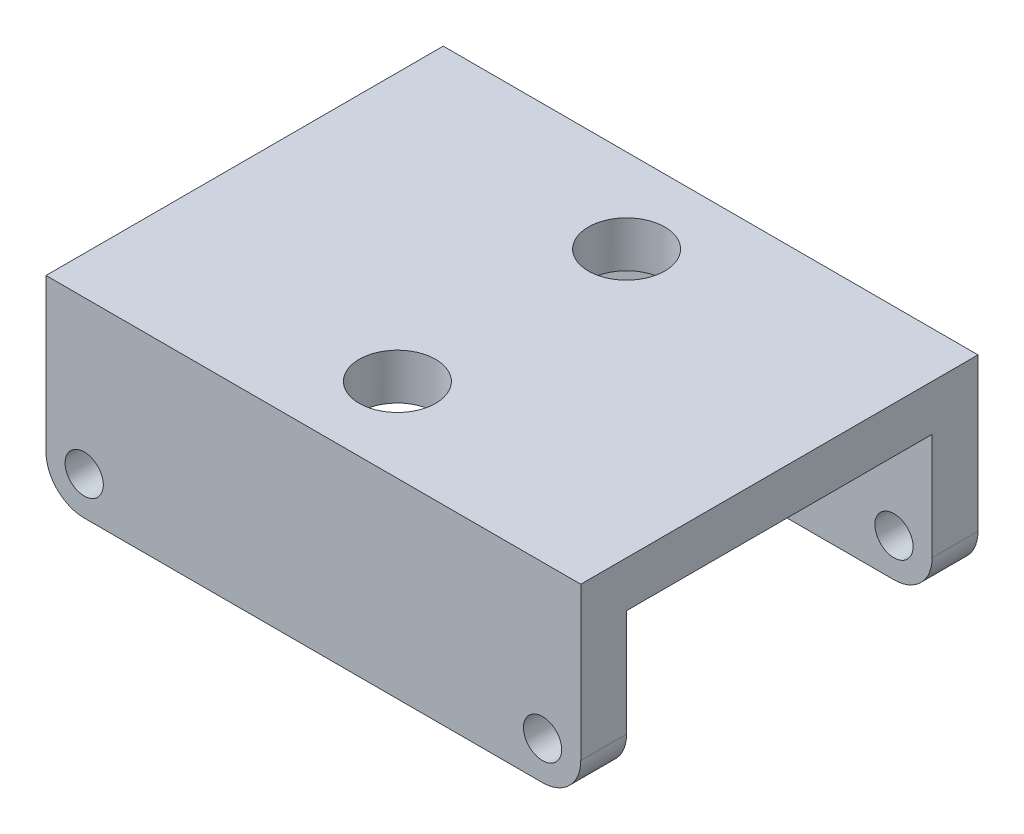
ISO-10303-21;
HEADER;
FILE_DESCRIPTION(('STEP AP214'),'2;1');
FILE_NAME('part.step','',(''),(''),'','','');
FILE_SCHEMA(('AUTOMOTIVE_DESIGN { 1 0 10303 214 1 1 1 1 }'));
ENDSEC;
DATA;
#1=APPLICATION_CONTEXT('core data for automotive mechanical design processes');
#2=APPLICATION_PROTOCOL_DEFINITION('international standard','automotive_design',2000,#1);
#3=PRODUCT_CONTEXT('',#1,'mechanical');
#4=PRODUCT('Part','Part','',(#3));
#5=PRODUCT_RELATED_PRODUCT_CATEGORY('part','',(#4));
#6=PRODUCT_DEFINITION_FORMATION('','',#4);
#7=PRODUCT_DEFINITION_CONTEXT('part definition',#1,'design');
#8=PRODUCT_DEFINITION('design','',#6,#7);
#9=PRODUCT_DEFINITION_SHAPE('','',#8);
#10=(LENGTH_UNIT() NAMED_UNIT(*) SI_UNIT(.MILLI.,.METRE.));
#11=(NAMED_UNIT(*) PLANE_ANGLE_UNIT() SI_UNIT($,.RADIAN.));
#12=(NAMED_UNIT(*) SI_UNIT($,.STERADIAN.) SOLID_ANGLE_UNIT());
#13=UNCERTAINTY_MEASURE_WITH_UNIT(LENGTH_MEASURE(1.E-05),#10,'distance_accuracy_value','');
#14=(GEOMETRIC_REPRESENTATION_CONTEXT(3) GLOBAL_UNCERTAINTY_ASSIGNED_CONTEXT((#13)) GLOBAL_UNIT_ASSIGNED_CONTEXT((#10,
#11,#12)) REPRESENTATION_CONTEXT('',''));
#15=CARTESIAN_POINT('',(0.,0.,0.));
#16=DIRECTION('',(0.,0.,1.));
#17=DIRECTION('',(1.,0.,0.));
#18=AXIS2_PLACEMENT_3D('',#15,#16,#17);
#19=CARTESIAN_POINT('',(22.2297705016347,10.4554465319777,52.));
#20=DIRECTION('',(0.,-1.,0.));
#21=DIRECTION('',(1.,0.,0.));
#22=AXIS2_PLACEMENT_3D('',#19,#20,#21);
#23=PLANE('',#22);
#24=DIRECTION('',(-1.,0.,0.));
#25=VECTOR('',#24,1.);
#26=CARTESIAN_POINT('',(22.2297705016347,10.4554465319777,0.));
#27=LINE('',#26,#25);
#28=CARTESIAN_POINT('',(22.2297705016347,10.4554465319777,0.));
#29=VERTEX_POINT('',#28);
#30=CARTESIAN_POINT('',(-47.7702294983653,10.4554465319777,0.));
#31=VERTEX_POINT('',#30);
#32=EDGE_CURVE('E197',#29,#31,#27,.T.);
#33=ORIENTED_EDGE('',*,*,#32,.T.);
#34=DIRECTION('',(0.,0.,-1.));
#35=VECTOR('',#34,1.);
#36=CARTESIAN_POINT('',(-47.7702294983653,10.4554465319777,52.));
#37=LINE('',#36,#35);
#38=CARTESIAN_POINT('',(-47.7702294983653,10.4554465319777,52.));
#39=VERTEX_POINT('',#38);
#40=EDGE_CURVE('E224',#39,#31,#37,.T.);
#41=ORIENTED_EDGE('',*,*,#40,.F.);
#42=DIRECTION('',(-1.,0.,0.));
#43=VECTOR('',#42,1.);
#44=CARTESIAN_POINT('',(22.2297705016347,10.4554465319777,52.));
#45=LINE('',#44,#43);
#46=CARTESIAN_POINT('',(22.2297705016347,10.4554465319777,52.));
#47=VERTEX_POINT('',#46);
#48=EDGE_CURVE('E200',#47,#39,#45,.T.);
#49=ORIENTED_EDGE('',*,*,#48,.F.);
#50=DIRECTION('',(0.,0.,-1.));
#51=VECTOR('',#50,1.);
#52=CARTESIAN_POINT('',(22.2297705016347,10.4554465319777,52.));
#53=LINE('',#52,#51);
#54=EDGE_CURVE('E212',#47,#29,#53,.T.);
#55=ORIENTED_EDGE('',*,*,#54,.T.);
#56=EDGE_LOOP('',(#33,#41,#49,#55));
#57=FACE_BOUND('',#56,.T.);
#58=CARTESIAN_POINT('',(-12.7702294983653,10.4554465319777,41.));
#59=DIRECTION('',(0.,-1.,0.));
#60=DIRECTION('',(1.,0.,0.));
#61=AXIS2_PLACEMENT_3D('',#58,#59,#60);
#62=CIRCLE('',#61,5.);
#63=CARTESIAN_POINT('',(-7.77022949836533,10.4554465319777,41.));
#64=VERTEX_POINT('',#63);
#65=EDGE_CURVE('E327',#64,#64,#62,.T.);
#66=ORIENTED_EDGE('',*,*,#65,.T.);
#67=EDGE_LOOP('',(#66));
#68=FACE_BOUND('',#67,.T.);
#69=CARTESIAN_POINT('',(-12.7702294983653,10.4554465319777,11.));
#70=DIRECTION('',(0.,1.,0.));
#71=DIRECTION('',(-1.,0.,0.));
#72=AXIS2_PLACEMENT_3D('',#69,#70,#71);
#73=CIRCLE('',#72,5.);
#74=CARTESIAN_POINT('',(-17.7702294983653,10.4554465319777,11.));
#75=VERTEX_POINT('',#74);
#76=EDGE_CURVE('E325',#75,#75,#73,.T.);
#77=ORIENTED_EDGE('',*,*,#76,.F.);
#78=EDGE_LOOP('',(#77));
#79=FACE_BOUND('',#78,.T.);
#80=ADVANCED_FACE('F35',(#57,#68,#79),#23,.F.);
#81=CARTESIAN_POINT('',(22.2297705016347,4.45544653197772,46.));
#82=DIRECTION('',(0.,1.,0.));
#83=DIRECTION('',(-1.,0.,0.));
#84=AXIS2_PLACEMENT_3D('',#81,#82,#83);
#85=PLANE('',#84);
#86=DIRECTION('',(-1.,0.,0.));
#87=VECTOR('',#86,1.);
#88=CARTESIAN_POINT('',(22.2297705016347,4.45544653197772,6.));
#89=LINE('',#88,#87);
#90=CARTESIAN_POINT('',(-12.7702294983653,4.4554465319777,6.));
#91=VERTEX_POINT('',#90);
#92=CARTESIAN_POINT('',(-47.7702294983653,4.45544653197769,6.));
#93=VERTEX_POINT('',#92);
#94=EDGE_CURVE('E139',#91,#93,#89,.T.);
#95=ORIENTED_EDGE('',*,*,#94,.F.);
#96=CARTESIAN_POINT('',(-12.7702294983653,4.45544653197771,11.));
#97=DIRECTION('',(0.,1.,0.));
#98=DIRECTION('',(-1.,0.,0.));
#99=AXIS2_PLACEMENT_3D('',#96,#97,#98);
#100=CIRCLE('',#99,5.);
#101=EDGE_CURVE('E55',#91,#91,#100,.T.);
#102=ORIENTED_EDGE('',*,*,#101,.T.);
#103=CARTESIAN_POINT('',(22.2297705016347,4.45544653197772,6.));
#104=VERTEX_POINT('',#103);
#105=EDGE_CURVE('E129',#104,#91,#89,.T.);
#106=ORIENTED_EDGE('',*,*,#105,.F.);
#107=DIRECTION('',(0.,0.,-1.));
#108=VECTOR('',#107,1.);
#109=CARTESIAN_POINT('',(22.2297705016347,4.45544653197772,46.));
#110=LINE('',#109,#108);
#111=CARTESIAN_POINT('',(22.2297705016347,4.45544653197772,46.));
#112=VERTEX_POINT('',#111);
#113=EDGE_CURVE('E135',#112,#104,#110,.T.);
#114=ORIENTED_EDGE('',*,*,#113,.F.);
#115=DIRECTION('',(-1.,0.,0.));
#116=VECTOR('',#115,1.);
#117=CARTESIAN_POINT('',(22.2297705016347,4.45544653197772,46.));
#118=LINE('',#117,#116);
#119=CARTESIAN_POINT('',(-12.7702294983653,4.45544653197771,46.));
#120=VERTEX_POINT('',#119);
#121=EDGE_CURVE('E167',#112,#120,#118,.T.);
#122=ORIENTED_EDGE('',*,*,#121,.T.);
#123=CARTESIAN_POINT('',(-12.7702294983653,4.45544653197771,41.));
#124=DIRECTION('',(0.,1.,0.));
#125=DIRECTION('',(-1.,0.,0.));
#126=AXIS2_PLACEMENT_3D('',#123,#124,#125);
#127=CIRCLE('',#126,5.);
#128=EDGE_CURVE('E50',#120,#120,#127,.F.);
#129=ORIENTED_EDGE('',*,*,#128,.F.);
#130=CARTESIAN_POINT('',(-47.7702294983653,4.4554465319777,46.));
#131=VERTEX_POINT('',#130);
#132=EDGE_CURVE('E170',#120,#131,#118,.T.);
#133=ORIENTED_EDGE('',*,*,#132,.T.);
#134=DIRECTION('',(0.,0.,-1.));
#135=VECTOR('',#134,1.);
#136=CARTESIAN_POINT('',(-47.7702294983653,4.4554465319777,46.));
#137=LINE('',#136,#135);
#138=EDGE_CURVE('E163',#131,#93,#137,.T.);
#139=ORIENTED_EDGE('',*,*,#138,.T.);
#140=EDGE_LOOP('',(#95,#102,#106,#114,#122,#129,#133,#139));
#141=FACE_BOUND('',#140,.T.);
#142=ADVANCED_FACE('F132',(#141),#85,.F.);
#143=CARTESIAN_POINT('',(17.2297705016347,-9.5445534680223,52.));
#144=DIRECTION('',(0.,0.,-1.));
#145=DIRECTION('',(-1.,0.,0.));
#146=AXIS2_PLACEMENT_3D('',#143,#144,#145);
#147=CYLINDRICAL_SURFACE('',#146,5.);
#148=CARTESIAN_POINT('',(17.2297705016347,-9.5445534680223,46.));
#149=DIRECTION('',(0.,0.,1.));
#150=DIRECTION('',(1.,0.,0.));
#151=AXIS2_PLACEMENT_3D('',#148,#149,#150);
#152=CIRCLE('',#151,5.);
#153=CARTESIAN_POINT('',(22.2297705016347,-9.5445534680223,46.));
#154=VERTEX_POINT('',#153);
#155=CARTESIAN_POINT('',(17.2297705016347,-14.5445534680223,46.));
#156=VERTEX_POINT('',#155);
#157=EDGE_CURVE('E185',#154,#156,#152,.F.);
#158=ORIENTED_EDGE('',*,*,#157,.F.);
#159=DIRECTION('',(0.,0.,-1.));
#160=VECTOR('',#159,1.);
#161=CARTESIAN_POINT('',(22.2297705016347,-9.5445534680223,52.));
#162=LINE('',#161,#160);
#163=CARTESIAN_POINT('',(22.2297705016347,-9.5445534680223,52.));
#164=VERTEX_POINT('',#163);
#165=EDGE_CURVE('E240',#164,#154,#162,.T.);
#166=ORIENTED_EDGE('',*,*,#165,.F.);
#167=CARTESIAN_POINT('',(17.2297705016347,-9.5445534680223,52.));
#168=DIRECTION('',(0.,0.,1.));
#169=DIRECTION('',(1.,0.,0.));
#170=AXIS2_PLACEMENT_3D('',#167,#168,#169);
#171=CIRCLE('',#170,5.);
#172=CARTESIAN_POINT('',(17.2297705016347,-14.5445534680223,52.));
#173=VERTEX_POINT('',#172);
#174=EDGE_CURVE('E44',#173,#164,#171,.T.);
#175=ORIENTED_EDGE('',*,*,#174,.F.);
#176=DIRECTION('',(0.,0.,-1.));
#177=VECTOR('',#176,1.);
#178=CARTESIAN_POINT('',(17.2297705016347,-14.5445534680223,52.));
#179=LINE('',#178,#177);
#180=EDGE_CURVE('E242',#156,#173,#179,.F.);
#181=ORIENTED_EDGE('',*,*,#180,.F.);
#182=EDGE_LOOP('',(#158,#166,#175,#181));
#183=FACE_BOUND('',#182,.T.);
#184=ADVANCED_FACE('F284',(#183),#147,.T.);
#185=CARTESIAN_POINT('',(-42.7702294983653,-9.54455346802231,52.));
#186=DIRECTION('',(0.,0.,-1.));
#187=DIRECTION('',(-1.,0.,0.));
#188=AXIS2_PLACEMENT_3D('',#185,#186,#187);
#189=CYLINDRICAL_SURFACE('',#188,5.);
#190=CARTESIAN_POINT('',(-42.7702294983653,-9.54455346802231,46.));
#191=DIRECTION('',(0.,0.,1.));
#192=DIRECTION('',(1.,0.,0.));
#193=AXIS2_PLACEMENT_3D('',#190,#191,#192);
#194=CIRCLE('',#193,5.);
#195=CARTESIAN_POINT('',(-42.7702294983653,-14.5445534680223,46.));
#196=VERTEX_POINT('',#195);
#197=CARTESIAN_POINT('',(-47.7702294983653,-9.5445534680223,46.));
#198=VERTEX_POINT('',#197);
#199=EDGE_CURVE('E183',#196,#198,#194,.F.);
#200=ORIENTED_EDGE('',*,*,#199,.F.);
#201=DIRECTION('',(0.,0.,-1.));
#202=VECTOR('',#201,1.);
#203=CARTESIAN_POINT('',(-42.7702294983653,-14.5445534680223,52.));
#204=LINE('',#203,#202);
#205=CARTESIAN_POINT('',(-42.7702294983653,-14.5445534680223,52.));
#206=VERTEX_POINT('',#205);
#207=EDGE_CURVE('E228',#206,#196,#204,.T.);
#208=ORIENTED_EDGE('',*,*,#207,.F.);
#209=CARTESIAN_POINT('',(-42.7702294983653,-9.54455346802231,52.));
#210=DIRECTION('',(0.,0.,1.));
#211=DIRECTION('',(1.,0.,0.));
#212=AXIS2_PLACEMENT_3D('',#209,#210,#211);
#213=CIRCLE('',#212,5.);
#214=CARTESIAN_POINT('',(-47.7702294983653,-9.5445534680223,52.));
#215=VERTEX_POINT('',#214);
#216=EDGE_CURVE('E235',#215,#206,#213,.T.);
#217=ORIENTED_EDGE('',*,*,#216,.F.);
#218=DIRECTION('',(0.,0.,-1.));
#219=VECTOR('',#218,1.);
#220=CARTESIAN_POINT('',(-47.7702294983653,-9.54455346802231,52.));
#221=LINE('',#220,#219);
#222=EDGE_CURVE('E231',#198,#215,#221,.F.);
#223=ORIENTED_EDGE('',*,*,#222,.F.);
#224=EDGE_LOOP('',(#200,#208,#217,#223));
#225=FACE_BOUND('',#224,.T.);
#226=ADVANCED_FACE('F290',(#225),#189,.T.);
#227=CARTESIAN_POINT('',(-47.7702294983653,-14.5445534680223,52.));
#228=DIRECTION('',(0.,1.,0.));
#229=DIRECTION('',(-1.,0.,0.));
#230=AXIS2_PLACEMENT_3D('',#227,#228,#229);
#231=PLANE('',#230);
#232=ORIENTED_EDGE('',*,*,#207,.T.);
#233=DIRECTION('',(-1.,0.,0.));
#234=VECTOR('',#233,1.);
#235=CARTESIAN_POINT('',(22.2297705016347,-14.5445534680223,46.));
#236=LINE('',#235,#234);
#237=EDGE_CURVE('E171',#156,#196,#236,.T.);
#238=ORIENTED_EDGE('',*,*,#237,.F.);
#239=ORIENTED_EDGE('',*,*,#180,.T.);
#240=DIRECTION('',(1.,0.,0.));
#241=VECTOR('',#240,1.);
#242=CARTESIAN_POINT('',(-47.7702294983653,-14.5445534680223,52.));
#243=LINE('',#242,#241);
#244=EDGE_CURVE('E207',#206,#173,#243,.T.);
#245=ORIENTED_EDGE('',*,*,#244,.F.);
#246=EDGE_LOOP('',(#232,#238,#239,#245));
#247=FACE_BOUND('',#246,.T.);
#248=ADVANCED_FACE('F297',(#247),#231,.F.);
#249=CARTESIAN_POINT('',(-42.7702294983653,-9.54455346802231,52.));
#250=DIRECTION('',(0.,0.,-1.));
#251=DIRECTION('',(-1.,0.,0.));
#252=AXIS2_PLACEMENT_3D('',#249,#250,#251);
#253=CYLINDRICAL_SURFACE('',#252,2.5);
#254=CARTESIAN_POINT('',(-42.7702294983653,-9.54455346802231,46.));
#255=DIRECTION('',(0.,0.,1.));
#256=DIRECTION('',(1.,0.,0.));
#257=AXIS2_PLACEMENT_3D('',#254,#255,#256);
#258=CIRCLE('',#257,2.5);
#259=CARTESIAN_POINT('',(-45.2702294983653,-9.54455346802231,46.));
#260=VERTEX_POINT('',#259);
#261=EDGE_CURVE('E180',#260,#260,#258,.T.);
#262=CARTESIAN_POINT('',(-42.7702294983653,-9.54455346802231,52.));
#263=DIRECTION('',(0.,0.,1.));
#264=DIRECTION('',(1.,0.,0.));
#265=AXIS2_PLACEMENT_3D('',#262,#263,#264);
#266=CIRCLE('',#265,2.5);
#267=CARTESIAN_POINT('',(-45.2702294983653,-9.54455346802231,52.));
#268=VERTEX_POINT('',#267);
#269=EDGE_CURVE('E194',#268,#268,#266,.T.);
#270=CARTESIAN_POINT('',(-45.2702294983653,-9.54455346802231,46.));
#271=CARTESIAN_POINT('',(-45.2702294983653,-9.54455346802231,46.0625));
#272=CARTESIAN_POINT('',(-45.2702294983653,-9.54455346802231,46.125));
#273=CARTESIAN_POINT('',(-45.2702294983653,-9.54455346802231,46.25));
#274=CARTESIAN_POINT('',(-45.2702294983653,-9.54455346802231,46.3125));
#275=CARTESIAN_POINT('',(-45.2702294983653,-9.54455346802231,46.4375));
#276=CARTESIAN_POINT('',(-45.2702294983653,-9.54455346802231,46.5));
#277=CARTESIAN_POINT('',(-45.2702294983653,-9.54455346802231,46.625));
#278=CARTESIAN_POINT('',(-45.2702294983653,-9.54455346802231,46.6875));
#279=CARTESIAN_POINT('',(-45.2702294983653,-9.54455346802231,46.8125));
#280=CARTESIAN_POINT('',(-45.2702294983653,-9.54455346802231,46.875));
#281=CARTESIAN_POINT('',(-45.2702294983653,-9.54455346802231,47.));
#282=CARTESIAN_POINT('',(-45.2702294983653,-9.54455346802231,47.0625));
#283=CARTESIAN_POINT('',(-45.2702294983653,-9.54455346802231,47.1875));
#284=CARTESIAN_POINT('',(-45.2702294983653,-9.54455346802231,47.25));
#285=CARTESIAN_POINT('',(-45.2702294983653,-9.54455346802231,47.375));
#286=CARTESIAN_POINT('',(-45.2702294983653,-9.54455346802231,47.4375));
#287=CARTESIAN_POINT('',(-45.2702294983653,-9.54455346802231,47.5625));
#288=CARTESIAN_POINT('',(-45.2702294983653,-9.54455346802231,47.625));
#289=CARTESIAN_POINT('',(-45.2702294983653,-9.54455346802231,47.75));
#290=CARTESIAN_POINT('',(-45.2702294983653,-9.54455346802231,47.8125));
#291=CARTESIAN_POINT('',(-45.2702294983653,-9.54455346802231,47.9375));
#292=CARTESIAN_POINT('',(-45.2702294983653,-9.54455346802231,48.));
#293=CARTESIAN_POINT('',(-45.2702294983653,-9.54455346802231,48.125));
#294=CARTESIAN_POINT('',(-45.2702294983653,-9.54455346802231,48.1875));
#295=CARTESIAN_POINT('',(-45.2702294983653,-9.54455346802231,48.3125));
#296=CARTESIAN_POINT('',(-45.2702294983653,-9.54455346802231,48.375));
#297=CARTESIAN_POINT('',(-45.2702294983653,-9.54455346802231,48.5));
#298=CARTESIAN_POINT('',(-45.2702294983653,-9.54455346802231,48.5625));
#299=CARTESIAN_POINT('',(-45.2702294983653,-9.54455346802231,48.6875));
#300=CARTESIAN_POINT('',(-45.2702294983653,-9.54455346802231,48.75));
#301=CARTESIAN_POINT('',(-45.2702294983653,-9.54455346802231,48.875));
#302=CARTESIAN_POINT('',(-45.2702294983653,-9.54455346802231,48.9375));
#303=CARTESIAN_POINT('',(-45.2702294983653,-9.54455346802231,49.0625));
#304=CARTESIAN_POINT('',(-45.2702294983653,-9.54455346802231,49.125));
#305=CARTESIAN_POINT('',(-45.2702294983653,-9.54455346802231,49.25));
#306=CARTESIAN_POINT('',(-45.2702294983653,-9.54455346802231,49.3125));
#307=CARTESIAN_POINT('',(-45.2702294983653,-9.54455346802231,49.4375));
#308=CARTESIAN_POINT('',(-45.2702294983653,-9.54455346802231,49.5));
#309=CARTESIAN_POINT('',(-45.2702294983653,-9.54455346802231,49.625));
#310=CARTESIAN_POINT('',(-45.2702294983653,-9.54455346802231,49.6875));
#311=CARTESIAN_POINT('',(-45.2702294983653,-9.54455346802231,49.8125));
#312=CARTESIAN_POINT('',(-45.2702294983653,-9.54455346802231,49.875));
#313=CARTESIAN_POINT('',(-45.2702294983653,-9.54455346802231,50.));
#314=CARTESIAN_POINT('',(-45.2702294983653,-9.54455346802231,50.0625));
#315=CARTESIAN_POINT('',(-45.2702294983653,-9.54455346802231,50.1875));
#316=CARTESIAN_POINT('',(-45.2702294983653,-9.54455346802231,50.25));
#317=CARTESIAN_POINT('',(-45.2702294983653,-9.54455346802231,50.375));
#318=CARTESIAN_POINT('',(-45.2702294983653,-9.54455346802231,50.4375));
#319=CARTESIAN_POINT('',(-45.2702294983653,-9.54455346802231,50.5625));
#320=CARTESIAN_POINT('',(-45.2702294983653,-9.54455346802231,50.625));
#321=CARTESIAN_POINT('',(-45.2702294983653,-9.54455346802231,50.75));
#322=CARTESIAN_POINT('',(-45.2702294983653,-9.54455346802231,50.8125));
#323=CARTESIAN_POINT('',(-45.2702294983653,-9.54455346802231,50.9375));
#324=CARTESIAN_POINT('',(-45.2702294983653,-9.54455346802231,51.));
#325=CARTESIAN_POINT('',(-45.2702294983653,-9.54455346802231,51.125));
#326=CARTESIAN_POINT('',(-45.2702294983653,-9.54455346802231,51.1875));
#327=CARTESIAN_POINT('',(-45.2702294983653,-9.54455346802231,51.3125));
#328=CARTESIAN_POINT('',(-45.2702294983653,-9.54455346802231,51.375));
#329=CARTESIAN_POINT('',(-45.2702294983653,-9.54455346802231,51.5));
#330=CARTESIAN_POINT('',(-45.2702294983653,-9.54455346802231,51.5625));
#331=CARTESIAN_POINT('',(-45.2702294983653,-9.54455346802231,51.6875));
#332=CARTESIAN_POINT('',(-45.2702294983653,-9.54455346802231,51.75));
#333=CARTESIAN_POINT('',(-45.2702294983653,-9.54455346802231,51.875));
#334=CARTESIAN_POINT('',(-45.2702294983653,-9.54455346802231,51.9375));
#335=CARTESIAN_POINT('',(-45.2702294983653,-9.54455346802231,52.));
#336=B_SPLINE_CURVE_WITH_KNOTS('',3,(#270,#271,#272,#273,#274,#275,#276,#277,#278,#279,#280,
#281,#282,#283,#284,#285,#286,#287,#288,#289,#290,#291,#292,#293,#294,#295,#296,#297,#298,#299,
#300,#301,#302,#303,#304,#305,#306,#307,#308,#309,#310,#311,#312,#313,#314,#315,#316,#317,#318,
#319,#320,#321,#322,#323,#324,#325,#326,#327,#328,#329,#330,#331,#332,#333,#334,#335),
.UNSPECIFIED.,.F.,.F.,(4,2,2,2,2,2,2,2,2,2,2,2,2,2,2,2,2,2,2,2,2,2,2,2,2,2,2,2,2,2,2,2,4),(0.,
0.1875,0.375,0.5625,0.750000000000001,0.937500000000001,1.125,1.3125,1.5,1.6875,1.875,2.0625,
2.25,2.4375,2.625,2.8125,3.,3.1875,3.375,3.5625,3.75,3.9375,4.125,4.3125,4.5,4.6875,4.875,
5.0625,5.25,5.4375,5.62500000000001,5.81250000000001,6.00000000000001),.UNSPECIFIED.);
#337=EDGE_CURVE('BSEAM303',#260,#268,#336,.T.);
#338=ORIENTED_EDGE('',*,*,#261,.F.);
#339=ORIENTED_EDGE('',*,*,#269,.T.);
#340=ORIENTED_EDGE('',*,*,#337,.T.);
#341=ORIENTED_EDGE('',*,*,#337,.F.);
#342=EDGE_LOOP('',(#338,#340,#339,#341));
#343=FACE_BOUND('',#342,.T.);
#344=ADVANCED_FACE('F303',(#343),#253,.F.);
#345=CARTESIAN_POINT('',(17.2297705016347,-9.5445534680223,52.));
#346=DIRECTION('',(0.,0.,-1.));
#347=DIRECTION('',(-1.,0.,0.));
#348=AXIS2_PLACEMENT_3D('',#345,#346,#347);
#349=CYLINDRICAL_SURFACE('',#348,2.5);
#350=CARTESIAN_POINT('',(17.2297705016347,-9.5445534680223,46.));
#351=DIRECTION('',(0.,0.,1.));
#352=DIRECTION('',(1.,0.,0.));
#353=AXIS2_PLACEMENT_3D('',#350,#351,#352);
#354=CIRCLE('',#353,2.5);
#355=CARTESIAN_POINT('',(14.7297705016347,-9.5445534680223,46.));
#356=VERTEX_POINT('',#355);
#357=EDGE_CURVE('E39',#356,#356,#354,.T.);
#358=CARTESIAN_POINT('',(17.2297705016347,-9.5445534680223,52.));
#359=DIRECTION('',(0.,0.,1.));
#360=DIRECTION('',(-1.,0.,0.));
#361=AXIS2_PLACEMENT_3D('',#358,#359,#360);
#362=CIRCLE('',#361,2.5);
#363=CARTESIAN_POINT('',(14.7297705016347,-9.5445534680223,52.));
#364=VERTEX_POINT('',#363);
#365=EDGE_CURVE('E188',#364,#364,#362,.T.);
#366=CARTESIAN_POINT('',(14.7297705016347,-9.5445534680223,46.));
#367=CARTESIAN_POINT('',(14.7297705016347,-9.5445534680223,46.0625));
#368=CARTESIAN_POINT('',(14.7297705016347,-9.5445534680223,46.125));
#369=CARTESIAN_POINT('',(14.7297705016347,-9.5445534680223,46.25));
#370=CARTESIAN_POINT('',(14.7297705016347,-9.5445534680223,46.3125));
#371=CARTESIAN_POINT('',(14.7297705016347,-9.5445534680223,46.4375));
#372=CARTESIAN_POINT('',(14.7297705016347,-9.5445534680223,46.5));
#373=CARTESIAN_POINT('',(14.7297705016347,-9.5445534680223,46.625));
#374=CARTESIAN_POINT('',(14.7297705016347,-9.5445534680223,46.6875));
#375=CARTESIAN_POINT('',(14.7297705016347,-9.5445534680223,46.8125));
#376=CARTESIAN_POINT('',(14.7297705016347,-9.5445534680223,46.875));
#377=CARTESIAN_POINT('',(14.7297705016347,-9.5445534680223,47.));
#378=CARTESIAN_POINT('',(14.7297705016347,-9.5445534680223,47.0625));
#379=CARTESIAN_POINT('',(14.7297705016347,-9.5445534680223,47.1875));
#380=CARTESIAN_POINT('',(14.7297705016347,-9.5445534680223,47.25));
#381=CARTESIAN_POINT('',(14.7297705016347,-9.5445534680223,47.375));
#382=CARTESIAN_POINT('',(14.7297705016347,-9.5445534680223,47.4375));
#383=CARTESIAN_POINT('',(14.7297705016347,-9.5445534680223,47.5625));
#384=CARTESIAN_POINT('',(14.7297705016347,-9.5445534680223,47.625));
#385=CARTESIAN_POINT('',(14.7297705016347,-9.5445534680223,47.75));
#386=CARTESIAN_POINT('',(14.7297705016347,-9.5445534680223,47.8125));
#387=CARTESIAN_POINT('',(14.7297705016347,-9.5445534680223,47.9375));
#388=CARTESIAN_POINT('',(14.7297705016347,-9.5445534680223,48.));
#389=CARTESIAN_POINT('',(14.7297705016347,-9.5445534680223,48.125));
#390=CARTESIAN_POINT('',(14.7297705016347,-9.5445534680223,48.1875));
#391=CARTESIAN_POINT('',(14.7297705016347,-9.5445534680223,48.3125));
#392=CARTESIAN_POINT('',(14.7297705016347,-9.5445534680223,48.375));
#393=CARTESIAN_POINT('',(14.7297705016347,-9.5445534680223,48.5));
#394=CARTESIAN_POINT('',(14.7297705016347,-9.5445534680223,48.5625));
#395=CARTESIAN_POINT('',(14.7297705016347,-9.5445534680223,48.6875));
#396=CARTESIAN_POINT('',(14.7297705016347,-9.5445534680223,48.75));
#397=CARTESIAN_POINT('',(14.7297705016347,-9.5445534680223,48.875));
#398=CARTESIAN_POINT('',(14.7297705016347,-9.5445534680223,48.9375));
#399=CARTESIAN_POINT('',(14.7297705016347,-9.5445534680223,49.0625));
#400=CARTESIAN_POINT('',(14.7297705016347,-9.5445534680223,49.125));
#401=CARTESIAN_POINT('',(14.7297705016347,-9.5445534680223,49.25));
#402=CARTESIAN_POINT('',(14.7297705016347,-9.5445534680223,49.3125));
#403=CARTESIAN_POINT('',(14.7297705016347,-9.5445534680223,49.4375));
#404=CARTESIAN_POINT('',(14.7297705016347,-9.5445534680223,49.5));
#405=CARTESIAN_POINT('',(14.7297705016347,-9.5445534680223,49.625));
#406=CARTESIAN_POINT('',(14.7297705016347,-9.5445534680223,49.6875));
#407=CARTESIAN_POINT('',(14.7297705016347,-9.5445534680223,49.8125));
#408=CARTESIAN_POINT('',(14.7297705016347,-9.5445534680223,49.875));
#409=CARTESIAN_POINT('',(14.7297705016347,-9.5445534680223,50.));
#410=CARTESIAN_POINT('',(14.7297705016347,-9.5445534680223,50.0625));
#411=CARTESIAN_POINT('',(14.7297705016347,-9.5445534680223,50.1875));
#412=CARTESIAN_POINT('',(14.7297705016347,-9.5445534680223,50.25));
#413=CARTESIAN_POINT('',(14.7297705016347,-9.5445534680223,50.375));
#414=CARTESIAN_POINT('',(14.7297705016347,-9.5445534680223,50.4375));
#415=CARTESIAN_POINT('',(14.7297705016347,-9.5445534680223,50.5625));
#416=CARTESIAN_POINT('',(14.7297705016347,-9.5445534680223,50.625));
#417=CARTESIAN_POINT('',(14.7297705016347,-9.5445534680223,50.75));
#418=CARTESIAN_POINT('',(14.7297705016347,-9.5445534680223,50.8125));
#419=CARTESIAN_POINT('',(14.7297705016347,-9.5445534680223,50.9375));
#420=CARTESIAN_POINT('',(14.7297705016347,-9.5445534680223,51.));
#421=CARTESIAN_POINT('',(14.7297705016347,-9.5445534680223,51.125));
#422=CARTESIAN_POINT('',(14.7297705016347,-9.5445534680223,51.1875));
#423=CARTESIAN_POINT('',(14.7297705016347,-9.5445534680223,51.3125));
#424=CARTESIAN_POINT('',(14.7297705016347,-9.5445534680223,51.375));
#425=CARTESIAN_POINT('',(14.7297705016347,-9.5445534680223,51.5));
#426=CARTESIAN_POINT('',(14.7297705016347,-9.5445534680223,51.5625));
#427=CARTESIAN_POINT('',(14.7297705016347,-9.5445534680223,51.6875));
#428=CARTESIAN_POINT('',(14.7297705016347,-9.5445534680223,51.75));
#429=CARTESIAN_POINT('',(14.7297705016347,-9.5445534680223,51.875));
#430=CARTESIAN_POINT('',(14.7297705016347,-9.5445534680223,51.9375));
#431=CARTESIAN_POINT('',(14.7297705016347,-9.5445534680223,52.));
#432=B_SPLINE_CURVE_WITH_KNOTS('',3,(#366,#367,#368,#369,#370,#371,#372,#373,#374,#375,#376,
#377,#378,#379,#380,#381,#382,#383,#384,#385,#386,#387,#388,#389,#390,#391,#392,#393,#394,#395,
#396,#397,#398,#399,#400,#401,#402,#403,#404,#405,#406,#407,#408,#409,#410,#411,#412,#413,#414,
#415,#416,#417,#418,#419,#420,#421,#422,#423,#424,#425,#426,#427,#428,#429,#430,#431),
.UNSPECIFIED.,.F.,.F.,(4,2,2,2,2,2,2,2,2,2,2,2,2,2,2,2,2,2,2,2,2,2,2,2,2,2,2,2,2,2,2,2,4),(0.,
0.1875,0.375,0.5625,0.750000000000001,0.937500000000001,1.125,1.3125,1.5,1.6875,1.875,2.0625,
2.25,2.4375,2.625,2.8125,3.,3.1875,3.375,3.5625,3.75,3.9375,4.125,4.3125,4.5,4.6875,4.875,
5.0625,5.25,5.4375,5.62500000000001,5.81250000000001,6.00000000000001),.UNSPECIFIED.);
#433=EDGE_CURVE('BSEAM256',#356,#364,#432,.T.);
#434=ORIENTED_EDGE('',*,*,#357,.F.);
#435=ORIENTED_EDGE('',*,*,#365,.T.);
#436=ORIENTED_EDGE('',*,*,#433,.T.);
#437=ORIENTED_EDGE('',*,*,#433,.F.);
#438=EDGE_LOOP('',(#434,#436,#435,#437));
#439=FACE_BOUND('',#438,.T.);
#440=ADVANCED_FACE('F256',(#439),#349,.F.);
#441=CARTESIAN_POINT('',(17.2297705016347,-9.5445534680223,6.00000000000001));
#442=DIRECTION('',(0.,0.,-1.));
#443=DIRECTION('',(0.,1.,0.));
#444=AXIS2_PLACEMENT_3D('',#441,#442,#443);
#445=CIRCLE('',#444,5.);
#446=CARTESIAN_POINT('',(17.2297705016347,-14.5445534680223,6.00000000000001));
#447=VERTEX_POINT('',#446);
#448=CARTESIAN_POINT('',(22.2297705016347,-9.5445534680223,6.));
#449=VERTEX_POINT('',#448);
#450=EDGE_CURVE('E147',#447,#449,#445,.F.);
#451=ORIENTED_EDGE('',*,*,#450,.F.);
#452=CARTESIAN_POINT('',(17.2297705016347,-14.5445534680223,0.));
#453=VERTEX_POINT('',#452);
#454=EDGE_CURVE('E243',#453,#447,#179,.F.);
#455=ORIENTED_EDGE('',*,*,#454,.F.);
#456=CARTESIAN_POINT('',(17.2297705016347,-9.5445534680223,0.));
#457=DIRECTION('',(0.,0.,1.));
#458=DIRECTION('',(1.,0.,0.));
#459=AXIS2_PLACEMENT_3D('',#456,#457,#458);
#460=CIRCLE('',#459,5.);
#461=CARTESIAN_POINT('',(22.2297705016347,-9.5445534680223,0.));
#462=VERTEX_POINT('',#461);
#463=EDGE_CURVE('E11',#462,#453,#460,.F.);
#464=ORIENTED_EDGE('',*,*,#463,.F.);
#465=EDGE_CURVE('E239',#449,#462,#162,.T.);
#466=ORIENTED_EDGE('',*,*,#465,.F.);
#467=EDGE_LOOP('',(#451,#455,#464,#466));
#468=FACE_BOUND('',#467,.T.);
#469=ADVANCED_FACE('F37',(#468),#147,.T.);
#470=CARTESIAN_POINT('',(-42.7702294983653,-9.54455346802231,6.00000000000001));
#471=DIRECTION('',(0.,0.,-1.));
#472=DIRECTION('',(0.,1.,0.));
#473=AXIS2_PLACEMENT_3D('',#470,#471,#472);
#474=CIRCLE('',#473,5.);
#475=CARTESIAN_POINT('',(-47.7702294983653,-9.5445534680223,6.));
#476=VERTEX_POINT('',#475);
#477=CARTESIAN_POINT('',(-42.7702294983653,-14.5445534680223,6.00000000000001));
#478=VERTEX_POINT('',#477);
#479=EDGE_CURVE('E177',#476,#478,#474,.F.);
#480=ORIENTED_EDGE('',*,*,#479,.F.);
#481=CARTESIAN_POINT('',(-47.7702294983653,-9.5445534680223,0.));
#482=VERTEX_POINT('',#481);
#483=EDGE_CURVE('E232',#482,#476,#221,.F.);
#484=ORIENTED_EDGE('',*,*,#483,.F.);
#485=CARTESIAN_POINT('',(-42.7702294983653,-9.54455346802231,0.));
#486=DIRECTION('',(0.,0.,1.));
#487=DIRECTION('',(1.,0.,0.));
#488=AXIS2_PLACEMENT_3D('',#485,#486,#487);
#489=CIRCLE('',#488,5.);
#490=CARTESIAN_POINT('',(-42.7702294983653,-14.5445534680223,0.));
#491=VERTEX_POINT('',#490);
#492=EDGE_CURVE('E237',#491,#482,#489,.F.);
#493=ORIENTED_EDGE('',*,*,#492,.F.);
#494=EDGE_CURVE('E227',#478,#491,#204,.T.);
#495=ORIENTED_EDGE('',*,*,#494,.F.);
#496=EDGE_LOOP('',(#480,#484,#493,#495));
#497=FACE_BOUND('',#496,.T.);
#498=ADVANCED_FACE('F272',(#497),#189,.T.);
#499=CARTESIAN_POINT('',(0.,0.,52.));
#500=DIRECTION('',(0.,0.,1.));
#501=DIRECTION('',(1.,0.,0.));
#502=AXIS2_PLACEMENT_3D('',#499,#500,#501);
#503=PLANE('',#502);
#504=ORIENTED_EDGE('',*,*,#269,.F.);
#505=EDGE_LOOP('',(#504));
#506=FACE_BOUND('',#505,.T.);
#507=ORIENTED_EDGE('',*,*,#244,.T.);
#508=ORIENTED_EDGE('',*,*,#174,.T.);
#509=DIRECTION('',(0.,1.,0.));
#510=VECTOR('',#509,1.);
#511=CARTESIAN_POINT('',(22.2297705016347,-14.5445534680223,52.));
#512=LINE('',#511,#510);
#513=EDGE_CURVE('E210',#164,#47,#512,.T.);
#514=ORIENTED_EDGE('',*,*,#513,.T.);
#515=ORIENTED_EDGE('',*,*,#48,.T.);
#516=DIRECTION('',(0.,-1.,0.));
#517=VECTOR('',#516,1.);
#518=CARTESIAN_POINT('',(-47.7702294983653,10.4554465319777,52.));
#519=LINE('',#518,#517);
#520=EDGE_CURVE('E203',#39,#215,#519,.T.);
#521=ORIENTED_EDGE('',*,*,#520,.T.);
#522=ORIENTED_EDGE('',*,*,#216,.T.);
#523=EDGE_LOOP('',(#507,#508,#514,#515,#521,#522));
#524=FACE_BOUND('',#523,.T.);
#525=ORIENTED_EDGE('',*,*,#365,.F.);
#526=EDGE_LOOP('',(#525));
#527=FACE_BOUND('',#526,.T.);
#528=ADVANCED_FACE('F262',(#506,#524,#527),#503,.T.);
#529=CARTESIAN_POINT('',(0.,0.,0.));
#530=DIRECTION('',(0.,0.,1.));
#531=DIRECTION('',(1.,0.,0.));
#532=AXIS2_PLACEMENT_3D('',#529,#530,#531);
#533=PLANE('',#532);
#534=DIRECTION('',(0.,1.,0.));
#535=VECTOR('',#534,1.);
#536=CARTESIAN_POINT('',(22.2297705016347,-14.5445534680223,0.));
#537=LINE('',#536,#535);
#538=EDGE_CURVE('E204',#462,#29,#537,.T.);
#539=ORIENTED_EDGE('',*,*,#538,.F.);
#540=ORIENTED_EDGE('',*,*,#463,.T.);
#541=DIRECTION('',(1.,0.,0.));
#542=VECTOR('',#541,1.);
#543=CARTESIAN_POINT('',(-47.7702294983653,-14.5445534680223,0.));
#544=LINE('',#543,#542);
#545=EDGE_CURVE('E218',#491,#453,#544,.T.);
#546=ORIENTED_EDGE('',*,*,#545,.F.);
#547=ORIENTED_EDGE('',*,*,#492,.T.);
#548=DIRECTION('',(0.,-1.,0.));
#549=VECTOR('',#548,1.);
#550=CARTESIAN_POINT('',(-47.7702294983653,10.4554465319777,0.));
#551=LINE('',#550,#549);
#552=EDGE_CURVE('E215',#31,#482,#551,.T.);
#553=ORIENTED_EDGE('',*,*,#552,.F.);
#554=ORIENTED_EDGE('',*,*,#32,.F.);
#555=EDGE_LOOP('',(#539,#540,#546,#547,#553,#554));
#556=FACE_BOUND('',#555,.T.);
#557=CARTESIAN_POINT('',(-42.7702294983653,-9.54455346802231,0.));
#558=DIRECTION('',(0.,0.,1.));
#559=DIRECTION('',(1.,0.,0.));
#560=AXIS2_PLACEMENT_3D('',#557,#558,#559);
#561=CIRCLE('',#560,2.5);
#562=CARTESIAN_POINT('',(-45.2702294983653,-9.54455346802231,0.));
#563=VERTEX_POINT('',#562);
#564=EDGE_CURVE('E191',#563,#563,#561,.T.);
#565=ORIENTED_EDGE('',*,*,#564,.T.);
#566=EDGE_LOOP('',(#565));
#567=FACE_BOUND('',#566,.T.);
#568=CARTESIAN_POINT('',(17.2297705016347,-9.5445534680223,0.));
#569=DIRECTION('',(0.,0.,1.));
#570=DIRECTION('',(-1.,0.,0.));
#571=AXIS2_PLACEMENT_3D('',#568,#569,#570);
#572=CIRCLE('',#571,2.5);
#573=CARTESIAN_POINT('',(14.7297705016347,-9.5445534680223,0.));
#574=VERTEX_POINT('',#573);
#575=EDGE_CURVE('E187',#574,#574,#572,.T.);
#576=ORIENTED_EDGE('',*,*,#575,.T.);
#577=EDGE_LOOP('',(#576));
#578=FACE_BOUND('',#577,.T.);
#579=ADVANCED_FACE('F259',(#556,#567,#578),#533,.F.);
#580=CARTESIAN_POINT('',(-47.7702294983653,10.4554465319777,52.));
#581=DIRECTION('',(1.,0.,0.));
#582=DIRECTION('',(0.,0.,-1.));
#583=AXIS2_PLACEMENT_3D('',#580,#581,#582);
#584=PLANE('',#583);
#585=ORIENTED_EDGE('',*,*,#138,.F.);
#586=DIRECTION('',(0.,1.,0.));
#587=VECTOR('',#586,1.);
#588=CARTESIAN_POINT('',(-47.7702294983653,-14.5445534680223,46.));
#589=LINE('',#588,#587);
#590=EDGE_CURVE('E154',#198,#131,#589,.T.);
#591=ORIENTED_EDGE('',*,*,#590,.F.);
#592=ORIENTED_EDGE('',*,*,#222,.T.);
#593=ORIENTED_EDGE('',*,*,#520,.F.);
#594=ORIENTED_EDGE('',*,*,#40,.T.);
#595=ORIENTED_EDGE('',*,*,#552,.T.);
#596=ORIENTED_EDGE('',*,*,#483,.T.);
#597=DIRECTION('',(0.,-1.,0.));
#598=VECTOR('',#597,1.);
#599=CARTESIAN_POINT('',(-47.7702294983653,4.45544653197769,6.));
#600=LINE('',#599,#598);
#601=EDGE_CURVE('E157',#93,#476,#600,.T.);
#602=ORIENTED_EDGE('',*,*,#601,.F.);
#603=EDGE_LOOP('',(#585,#591,#592,#593,#594,#595,#596,#602));
#604=FACE_BOUND('',#603,.T.);
#605=ADVANCED_FACE('F261',(#604),#584,.F.);
#606=ORIENTED_EDGE('',*,*,#454,.T.);
#607=DIRECTION('',(-1.,0.,0.));
#608=VECTOR('',#607,1.);
#609=CARTESIAN_POINT('',(22.2297705016347,-14.5445534680223,6.00000000000001));
#610=LINE('',#609,#608);
#611=EDGE_CURVE('E138',#447,#478,#610,.T.);
#612=ORIENTED_EDGE('',*,*,#611,.T.);
#613=ORIENTED_EDGE('',*,*,#494,.T.);
#614=ORIENTED_EDGE('',*,*,#545,.T.);
#615=EDGE_LOOP('',(#606,#612,#613,#614));
#616=FACE_BOUND('',#615,.T.);
#617=ADVANCED_FACE('F269',(#616),#231,.F.);
#618=CARTESIAN_POINT('',(22.2297705016347,-14.5445534680223,52.));
#619=DIRECTION('',(-1.,0.,0.));
#620=DIRECTION('',(0.,0.,1.));
#621=AXIS2_PLACEMENT_3D('',#618,#619,#620);
#622=PLANE('',#621);
#623=ORIENTED_EDGE('',*,*,#165,.T.);
#624=DIRECTION('',(0.,1.,0.));
#625=VECTOR('',#624,1.);
#626=CARTESIAN_POINT('',(22.2297705016347,-14.5445534680223,46.));
#627=LINE('',#626,#625);
#628=EDGE_CURVE('E150',#154,#112,#627,.T.);
#629=ORIENTED_EDGE('',*,*,#628,.T.);
#630=ORIENTED_EDGE('',*,*,#113,.T.);
#631=DIRECTION('',(0.,-1.,0.));
#632=VECTOR('',#631,1.);
#633=CARTESIAN_POINT('',(22.2297705016347,4.45544653197772,6.));
#634=LINE('',#633,#632);
#635=EDGE_CURVE('E142',#104,#449,#634,.T.);
#636=ORIENTED_EDGE('',*,*,#635,.T.);
#637=ORIENTED_EDGE('',*,*,#465,.T.);
#638=ORIENTED_EDGE('',*,*,#538,.T.);
#639=ORIENTED_EDGE('',*,*,#54,.F.);
#640=ORIENTED_EDGE('',*,*,#513,.F.);
#641=EDGE_LOOP('',(#623,#629,#630,#636,#637,#638,#639,#640));
#642=FACE_BOUND('',#641,.T.);
#643=ADVANCED_FACE('F153',(#642),#622,.F.);
#644=CARTESIAN_POINT('',(-42.7702294983653,-9.54455346802231,6.00000000000001));
#645=DIRECTION('',(0.,0.,-1.));
#646=DIRECTION('',(0.,1.,0.));
#647=AXIS2_PLACEMENT_3D('',#644,#645,#646);
#648=CIRCLE('',#647,2.5);
#649=CARTESIAN_POINT('',(-45.2702294983653,-9.54455346802231,6.00000000000001));
#650=VERTEX_POINT('',#649);
#651=EDGE_CURVE('E174',#650,#650,#648,.T.);
#652=CARTESIAN_POINT('',(-45.2702294983653,-9.54455346802231,6.00000000000001));
#653=CARTESIAN_POINT('',(-45.2702294983653,-9.54455346802231,5.93750000000001));
#654=CARTESIAN_POINT('',(-45.2702294983653,-9.54455346802231,5.87500000000001));
#655=CARTESIAN_POINT('',(-45.2702294983653,-9.54455346802231,5.75000000000001));
#656=CARTESIAN_POINT('',(-45.2702294983653,-9.54455346802231,5.68750000000001));
#657=CARTESIAN_POINT('',(-45.2702294983653,-9.54455346802231,5.56250000000001));
#658=CARTESIAN_POINT('',(-45.2702294983653,-9.54455346802231,5.50000000000001));
#659=CARTESIAN_POINT('',(-45.2702294983653,-9.54455346802231,5.375));
#660=CARTESIAN_POINT('',(-45.2702294983653,-9.54455346802231,5.3125));
#661=CARTESIAN_POINT('',(-45.2702294983653,-9.54455346802231,5.1875));
#662=CARTESIAN_POINT('',(-45.2702294983653,-9.54455346802231,5.125));
#663=CARTESIAN_POINT('',(-45.2702294983653,-9.54455346802231,5.));
#664=CARTESIAN_POINT('',(-45.2702294983653,-9.54455346802231,4.9375));
#665=CARTESIAN_POINT('',(-45.2702294983653,-9.54455346802231,4.8125));
#666=CARTESIAN_POINT('',(-45.2702294983653,-9.54455346802231,4.75));
#667=CARTESIAN_POINT('',(-45.2702294983653,-9.54455346802231,4.625));
#668=CARTESIAN_POINT('',(-45.2702294983653,-9.54455346802231,4.5625));
#669=CARTESIAN_POINT('',(-45.2702294983653,-9.54455346802231,4.4375));
#670=CARTESIAN_POINT('',(-45.2702294983653,-9.54455346802231,4.375));
#671=CARTESIAN_POINT('',(-45.2702294983653,-9.54455346802231,4.25));
#672=CARTESIAN_POINT('',(-45.2702294983653,-9.54455346802231,4.1875));
#673=CARTESIAN_POINT('',(-45.2702294983653,-9.54455346802231,4.0625));
#674=CARTESIAN_POINT('',(-45.2702294983653,-9.54455346802231,4.));
#675=CARTESIAN_POINT('',(-45.2702294983653,-9.54455346802231,3.875));
#676=CARTESIAN_POINT('',(-45.2702294983653,-9.54455346802231,3.8125));
#677=CARTESIAN_POINT('',(-45.2702294983653,-9.54455346802231,3.6875));
#678=CARTESIAN_POINT('',(-45.2702294983653,-9.54455346802231,3.625));
#679=CARTESIAN_POINT('',(-45.2702294983653,-9.54455346802231,3.5));
#680=CARTESIAN_POINT('',(-45.2702294983653,-9.54455346802231,3.4375));
#681=CARTESIAN_POINT('',(-45.2702294983653,-9.54455346802231,3.3125));
#682=CARTESIAN_POINT('',(-45.2702294983653,-9.54455346802231,3.25));
#683=CARTESIAN_POINT('',(-45.2702294983653,-9.54455346802231,3.125));
#684=CARTESIAN_POINT('',(-45.2702294983653,-9.54455346802231,3.0625));
#685=CARTESIAN_POINT('',(-45.2702294983653,-9.54455346802231,2.9375));
#686=CARTESIAN_POINT('',(-45.2702294983653,-9.54455346802231,2.875));
#687=CARTESIAN_POINT('',(-45.2702294983653,-9.54455346802231,2.75));
#688=CARTESIAN_POINT('',(-45.2702294983653,-9.54455346802231,2.6875));
#689=CARTESIAN_POINT('',(-45.2702294983653,-9.54455346802231,2.5625));
#690=CARTESIAN_POINT('',(-45.2702294983653,-9.54455346802231,2.5));
#691=CARTESIAN_POINT('',(-45.2702294983653,-9.54455346802231,2.375));
#692=CARTESIAN_POINT('',(-45.2702294983653,-9.54455346802231,2.3125));
#693=CARTESIAN_POINT('',(-45.2702294983653,-9.54455346802231,2.1875));
#694=CARTESIAN_POINT('',(-45.2702294983653,-9.54455346802231,2.125));
#695=CARTESIAN_POINT('',(-45.2702294983653,-9.54455346802231,2.));
#696=CARTESIAN_POINT('',(-45.2702294983653,-9.54455346802231,1.9375));
#697=CARTESIAN_POINT('',(-45.2702294983653,-9.54455346802231,1.8125));
#698=CARTESIAN_POINT('',(-45.2702294983653,-9.54455346802231,1.75));
#699=CARTESIAN_POINT('',(-45.2702294983653,-9.54455346802231,1.625));
#700=CARTESIAN_POINT('',(-45.2702294983653,-9.54455346802231,1.5625));
#701=CARTESIAN_POINT('',(-45.2702294983653,-9.54455346802231,1.4375));
#702=CARTESIAN_POINT('',(-45.2702294983653,-9.54455346802231,1.375));
#703=CARTESIAN_POINT('',(-45.2702294983653,-9.54455346802231,1.25));
#704=CARTESIAN_POINT('',(-45.2702294983653,-9.54455346802231,1.1875));
#705=CARTESIAN_POINT('',(-45.2702294983653,-9.54455346802231,1.0625));
#706=CARTESIAN_POINT('',(-45.2702294983653,-9.54455346802231,1.));
#707=CARTESIAN_POINT('',(-45.2702294983653,-9.54455346802231,0.875000000000001));
#708=CARTESIAN_POINT('',(-45.2702294983653,-9.54455346802231,0.812500000000001));
#709=CARTESIAN_POINT('',(-45.2702294983653,-9.54455346802231,0.687500000000001));
#710=CARTESIAN_POINT('',(-45.2702294983653,-9.54455346802231,0.625000000000001));
#711=CARTESIAN_POINT('',(-45.2702294983653,-9.54455346802231,0.5));
#712=CARTESIAN_POINT('',(-45.2702294983653,-9.54455346802231,0.4375));
#713=CARTESIAN_POINT('',(-45.2702294983653,-9.54455346802231,0.3125));
#714=CARTESIAN_POINT('',(-45.2702294983653,-9.54455346802231,0.25));
#715=CARTESIAN_POINT('',(-45.2702294983653,-9.54455346802231,0.125));
#716=CARTESIAN_POINT('',(-45.2702294983653,-9.54455346802231,0.0625000000000001));
#717=CARTESIAN_POINT('',(-45.2702294983653,-9.54455346802231,0.));
#718=B_SPLINE_CURVE_WITH_KNOTS('',3,(#652,#653,#654,#655,#656,#657,#658,#659,#660,#661,#662,
#663,#664,#665,#666,#667,#668,#669,#670,#671,#672,#673,#674,#675,#676,#677,#678,#679,#680,#681,
#682,#683,#684,#685,#686,#687,#688,#689,#690,#691,#692,#693,#694,#695,#696,#697,#698,#699,#700,
#701,#702,#703,#704,#705,#706,#707,#708,#709,#710,#711,#712,#713,#714,#715,#716,#717),
.UNSPECIFIED.,.F.,.F.,(4,2,2,2,2,2,2,2,2,2,2,2,2,2,2,2,2,2,2,2,2,2,2,2,2,2,2,2,2,2,2,2,4),(0.,
0.1875,0.375,0.5625,0.750000000000001,0.937500000000001,1.125,1.3125,1.5,1.6875,1.875,2.0625,
2.25,2.4375,2.625,2.8125,3.,3.1875,3.375,3.5625,3.75,3.9375,4.125,4.3125,4.5,4.6875,4.875,
5.0625,5.25,5.4375,5.62500000000001,5.81250000000001,6.00000000000001),.UNSPECIFIED.);
#719=EDGE_CURVE('BSEAM254',#650,#563,#718,.T.);
#720=ORIENTED_EDGE('',*,*,#651,.F.);
#721=ORIENTED_EDGE('',*,*,#564,.F.);
#722=ORIENTED_EDGE('',*,*,#719,.T.);
#723=ORIENTED_EDGE('',*,*,#719,.F.);
#724=EDGE_LOOP('',(#720,#722,#721,#723));
#725=FACE_BOUND('',#724,.T.);
#726=ADVANCED_FACE('F254',(#725),#253,.F.);
#727=CARTESIAN_POINT('',(17.2297705016347,-9.5445534680223,6.00000000000001));
#728=DIRECTION('',(0.,0.,-1.));
#729=DIRECTION('',(0.,1.,0.));
#730=AXIS2_PLACEMENT_3D('',#727,#728,#729);
#731=CIRCLE('',#730,2.5);
#732=CARTESIAN_POINT('',(14.7297705016347,-9.5445534680223,6.00000000000001));
#733=VERTEX_POINT('',#732);
#734=EDGE_CURVE('E169',#733,#733,#731,.T.);
#735=CARTESIAN_POINT('',(14.7297705016347,-9.5445534680223,6.00000000000001));
#736=CARTESIAN_POINT('',(14.7297705016347,-9.5445534680223,5.93750000000001));
#737=CARTESIAN_POINT('',(14.7297705016347,-9.5445534680223,5.87500000000001));
#738=CARTESIAN_POINT('',(14.7297705016347,-9.5445534680223,5.75000000000001));
#739=CARTESIAN_POINT('',(14.7297705016347,-9.5445534680223,5.68750000000001));
#740=CARTESIAN_POINT('',(14.7297705016347,-9.5445534680223,5.56250000000001));
#741=CARTESIAN_POINT('',(14.7297705016347,-9.5445534680223,5.50000000000001));
#742=CARTESIAN_POINT('',(14.7297705016347,-9.5445534680223,5.375));
#743=CARTESIAN_POINT('',(14.7297705016347,-9.5445534680223,5.3125));
#744=CARTESIAN_POINT('',(14.7297705016347,-9.5445534680223,5.1875));
#745=CARTESIAN_POINT('',(14.7297705016347,-9.5445534680223,5.125));
#746=CARTESIAN_POINT('',(14.7297705016347,-9.5445534680223,5.));
#747=CARTESIAN_POINT('',(14.7297705016347,-9.5445534680223,4.9375));
#748=CARTESIAN_POINT('',(14.7297705016347,-9.5445534680223,4.8125));
#749=CARTESIAN_POINT('',(14.7297705016347,-9.5445534680223,4.75));
#750=CARTESIAN_POINT('',(14.7297705016347,-9.5445534680223,4.625));
#751=CARTESIAN_POINT('',(14.7297705016347,-9.5445534680223,4.5625));
#752=CARTESIAN_POINT('',(14.7297705016347,-9.5445534680223,4.4375));
#753=CARTESIAN_POINT('',(14.7297705016347,-9.5445534680223,4.375));
#754=CARTESIAN_POINT('',(14.7297705016347,-9.5445534680223,4.25));
#755=CARTESIAN_POINT('',(14.7297705016347,-9.5445534680223,4.1875));
#756=CARTESIAN_POINT('',(14.7297705016347,-9.5445534680223,4.0625));
#757=CARTESIAN_POINT('',(14.7297705016347,-9.5445534680223,4.));
#758=CARTESIAN_POINT('',(14.7297705016347,-9.5445534680223,3.875));
#759=CARTESIAN_POINT('',(14.7297705016347,-9.5445534680223,3.8125));
#760=CARTESIAN_POINT('',(14.7297705016347,-9.5445534680223,3.6875));
#761=CARTESIAN_POINT('',(14.7297705016347,-9.5445534680223,3.625));
#762=CARTESIAN_POINT('',(14.7297705016347,-9.5445534680223,3.5));
#763=CARTESIAN_POINT('',(14.7297705016347,-9.5445534680223,3.4375));
#764=CARTESIAN_POINT('',(14.7297705016347,-9.5445534680223,3.3125));
#765=CARTESIAN_POINT('',(14.7297705016347,-9.5445534680223,3.25));
#766=CARTESIAN_POINT('',(14.7297705016347,-9.5445534680223,3.125));
#767=CARTESIAN_POINT('',(14.7297705016347,-9.5445534680223,3.0625));
#768=CARTESIAN_POINT('',(14.7297705016347,-9.5445534680223,2.9375));
#769=CARTESIAN_POINT('',(14.7297705016347,-9.5445534680223,2.875));
#770=CARTESIAN_POINT('',(14.7297705016347,-9.5445534680223,2.75));
#771=CARTESIAN_POINT('',(14.7297705016347,-9.5445534680223,2.6875));
#772=CARTESIAN_POINT('',(14.7297705016347,-9.5445534680223,2.5625));
#773=CARTESIAN_POINT('',(14.7297705016347,-9.5445534680223,2.5));
#774=CARTESIAN_POINT('',(14.7297705016347,-9.5445534680223,2.375));
#775=CARTESIAN_POINT('',(14.7297705016347,-9.5445534680223,2.3125));
#776=CARTESIAN_POINT('',(14.7297705016347,-9.5445534680223,2.1875));
#777=CARTESIAN_POINT('',(14.7297705016347,-9.5445534680223,2.125));
#778=CARTESIAN_POINT('',(14.7297705016347,-9.5445534680223,2.));
#779=CARTESIAN_POINT('',(14.7297705016347,-9.5445534680223,1.9375));
#780=CARTESIAN_POINT('',(14.7297705016347,-9.5445534680223,1.8125));
#781=CARTESIAN_POINT('',(14.7297705016347,-9.5445534680223,1.75));
#782=CARTESIAN_POINT('',(14.7297705016347,-9.5445534680223,1.625));
#783=CARTESIAN_POINT('',(14.7297705016347,-9.5445534680223,1.5625));
#784=CARTESIAN_POINT('',(14.7297705016347,-9.5445534680223,1.4375));
#785=CARTESIAN_POINT('',(14.7297705016347,-9.5445534680223,1.375));
#786=CARTESIAN_POINT('',(14.7297705016347,-9.5445534680223,1.25));
#787=CARTESIAN_POINT('',(14.7297705016347,-9.5445534680223,1.1875));
#788=CARTESIAN_POINT('',(14.7297705016347,-9.5445534680223,1.0625));
#789=CARTESIAN_POINT('',(14.7297705016347,-9.5445534680223,1.));
#790=CARTESIAN_POINT('',(14.7297705016347,-9.5445534680223,0.875000000000001));
#791=CARTESIAN_POINT('',(14.7297705016347,-9.5445534680223,0.812500000000001));
#792=CARTESIAN_POINT('',(14.7297705016347,-9.5445534680223,0.687500000000001));
#793=CARTESIAN_POINT('',(14.7297705016347,-9.5445534680223,0.625000000000001));
#794=CARTESIAN_POINT('',(14.7297705016347,-9.5445534680223,0.5));
#795=CARTESIAN_POINT('',(14.7297705016347,-9.5445534680223,0.4375));
#796=CARTESIAN_POINT('',(14.7297705016347,-9.5445534680223,0.3125));
#797=CARTESIAN_POINT('',(14.7297705016347,-9.5445534680223,0.25));
#798=CARTESIAN_POINT('',(14.7297705016347,-9.5445534680223,0.125));
#799=CARTESIAN_POINT('',(14.7297705016347,-9.5445534680223,0.0625000000000001));
#800=CARTESIAN_POINT('',(14.7297705016347,-9.5445534680223,0.));
#801=B_SPLINE_CURVE_WITH_KNOTS('',3,(#735,#736,#737,#738,#739,#740,#741,#742,#743,#744,#745,
#746,#747,#748,#749,#750,#751,#752,#753,#754,#755,#756,#757,#758,#759,#760,#761,#762,#763,#764,
#765,#766,#767,#768,#769,#770,#771,#772,#773,#774,#775,#776,#777,#778,#779,#780,#781,#782,#783,
#784,#785,#786,#787,#788,#789,#790,#791,#792,#793,#794,#795,#796,#797,#798,#799,#800),
.UNSPECIFIED.,.F.,.F.,(4,2,2,2,2,2,2,2,2,2,2,2,2,2,2,2,2,2,2,2,2,2,2,2,2,2,2,2,2,2,2,2,4),(0.,
0.1875,0.375,0.5625,0.750000000000001,0.937500000000001,1.125,1.3125,1.5,1.6875,1.875,2.0625,
2.25,2.4375,2.625,2.8125,3.,3.1875,3.375,3.5625,3.75,3.9375,4.125,4.3125,4.5,4.6875,4.875,
5.0625,5.25,5.4375,5.62500000000001,5.81250000000001,6.00000000000001),.UNSPECIFIED.);
#802=EDGE_CURVE('BSEAM250',#733,#574,#801,.T.);
#803=ORIENTED_EDGE('',*,*,#734,.F.);
#804=ORIENTED_EDGE('',*,*,#575,.F.);
#805=ORIENTED_EDGE('',*,*,#802,.T.);
#806=ORIENTED_EDGE('',*,*,#802,.F.);
#807=EDGE_LOOP('',(#803,#805,#804,#806));
#808=FACE_BOUND('',#807,.T.);
#809=ADVANCED_FACE('F250',(#808),#349,.F.);
#810=CARTESIAN_POINT('',(22.2297705016347,-14.5445534680223,46.));
#811=DIRECTION('',(0.,0.,1.));
#812=DIRECTION('',(1.,0.,0.));
#813=AXIS2_PLACEMENT_3D('',#810,#811,#812);
#814=PLANE('',#813);
#815=ORIENTED_EDGE('',*,*,#132,.F.);
#816=ORIENTED_EDGE('',*,*,#121,.F.);
#817=ORIENTED_EDGE('',*,*,#628,.F.);
#818=ORIENTED_EDGE('',*,*,#157,.T.);
#819=ORIENTED_EDGE('',*,*,#237,.T.);
#820=ORIENTED_EDGE('',*,*,#199,.T.);
#821=ORIENTED_EDGE('',*,*,#590,.T.);
#822=EDGE_LOOP('',(#815,#816,#817,#818,#819,#820,#821));
#823=FACE_BOUND('',#822,.T.);
#824=ORIENTED_EDGE('',*,*,#261,.T.);
#825=EDGE_LOOP('',(#824));
#826=FACE_BOUND('',#825,.T.);
#827=ORIENTED_EDGE('',*,*,#357,.T.);
#828=EDGE_LOOP('',(#827));
#829=FACE_BOUND('',#828,.T.);
#830=ADVANCED_FACE('F253',(#823,#826,#829),#814,.F.);
#831=CARTESIAN_POINT('',(22.2297705016347,4.45544653197772,6.));
#832=DIRECTION('',(0.,0.,-1.));
#833=DIRECTION('',(0.,1.,0.));
#834=AXIS2_PLACEMENT_3D('',#831,#832,#833);
#835=PLANE('',#834);
#836=ORIENTED_EDGE('',*,*,#479,.T.);
#837=ORIENTED_EDGE('',*,*,#611,.F.);
#838=ORIENTED_EDGE('',*,*,#450,.T.);
#839=ORIENTED_EDGE('',*,*,#635,.F.);
#840=ORIENTED_EDGE('',*,*,#105,.T.);
#841=ORIENTED_EDGE('',*,*,#94,.T.);
#842=ORIENTED_EDGE('',*,*,#601,.T.);
#843=EDGE_LOOP('',(#836,#837,#838,#839,#840,#841,#842));
#844=FACE_BOUND('',#843,.T.);
#845=ORIENTED_EDGE('',*,*,#651,.T.);
#846=EDGE_LOOP('',(#845));
#847=FACE_BOUND('',#846,.T.);
#848=ORIENTED_EDGE('',*,*,#734,.T.);
#849=EDGE_LOOP('',(#848));
#850=FACE_BOUND('',#849,.T.);
#851=ADVANCED_FACE('F144',(#844,#847,#850),#835,.F.);
#852=CARTESIAN_POINT('',(-12.7702294983653,-14.5445534680223,41.));
#853=DIRECTION('',(0.,1.,0.));
#854=DIRECTION('',(-1.,0.,0.));
#855=AXIS2_PLACEMENT_3D('',#852,#853,#854);
#856=CYLINDRICAL_SURFACE('',#855,5.);
#857=ORIENTED_EDGE('',*,*,#65,.F.);
#858=EDGE_LOOP('',(#857));
#859=FACE_BOUND('',#858,.T.);
#860=ORIENTED_EDGE('',*,*,#128,.T.);
#861=EDGE_LOOP('',(#860));
#862=FACE_BOUND('',#861,.T.);
#863=ADVANCED_FACE('F334',(#859,#862),#856,.F.);
#864=CARTESIAN_POINT('',(-12.7702294983653,-14.5445534680223,11.));
#865=DIRECTION('',(0.,1.,0.));
#866=DIRECTION('',(-1.,0.,0.));
#867=AXIS2_PLACEMENT_3D('',#864,#865,#866);
#868=CYLINDRICAL_SURFACE('',#867,5.);
#869=ORIENTED_EDGE('',*,*,#76,.T.);
#870=EDGE_LOOP('',(#869));
#871=FACE_BOUND('',#870,.T.);
#872=ORIENTED_EDGE('',*,*,#101,.F.);
#873=EDGE_LOOP('',(#872));
#874=FACE_BOUND('',#873,.T.);
#875=ADVANCED_FACE('F336',(#871,#874),#868,.F.);
#876=CLOSED_SHELL('',(#80,#142,#184,#226,#248,#344,#440,#469,#498,#528,#579,#605,#617,#643,#726,
#809,#830,#851,#863,#875));
#877=MANIFOLD_SOLID_BREP('B2',#876);
#878=ADVANCED_BREP_SHAPE_REPRESENTATION('',(#18,#877),#14);
#879=SHAPE_DEFINITION_REPRESENTATION(#9,#878);
ENDSEC;
END-ISO-10303-21;
